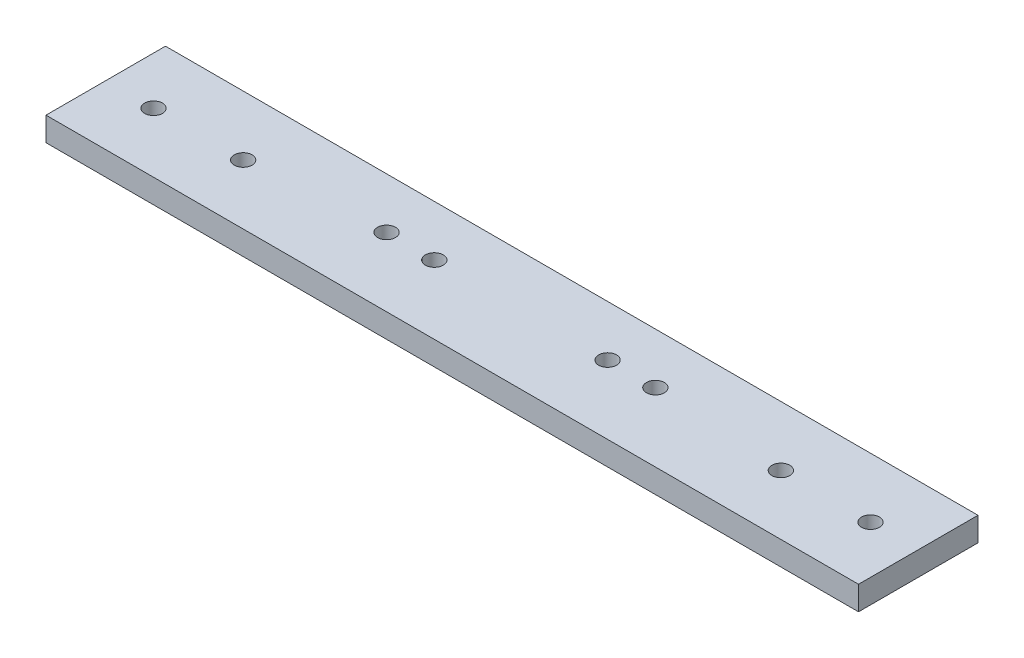
ISO-10303-21;
HEADER;
FILE_DESCRIPTION(('STEP AP214'),'2;1');
FILE_NAME('part.step','',(''),(''),'','','');
FILE_SCHEMA(('AUTOMOTIVE_DESIGN { 1 0 10303 214 1 1 1 1 }'));
ENDSEC;
DATA;
#1=APPLICATION_CONTEXT('core data for automotive mechanical design processes');
#2=APPLICATION_PROTOCOL_DEFINITION('international standard','automotive_design',2000,#1);
#3=PRODUCT_CONTEXT('',#1,'mechanical');
#4=PRODUCT('Part','Part','',(#3));
#5=PRODUCT_RELATED_PRODUCT_CATEGORY('part','',(#4));
#6=PRODUCT_DEFINITION_FORMATION('','',#4);
#7=PRODUCT_DEFINITION_CONTEXT('part definition',#1,'design');
#8=PRODUCT_DEFINITION('design','',#6,#7);
#9=PRODUCT_DEFINITION_SHAPE('','',#8);
#10=(LENGTH_UNIT() NAMED_UNIT(*) SI_UNIT(.MILLI.,.METRE.));
#11=(NAMED_UNIT(*) PLANE_ANGLE_UNIT() SI_UNIT($,.RADIAN.));
#12=(NAMED_UNIT(*) SI_UNIT($,.STERADIAN.) SOLID_ANGLE_UNIT());
#13=UNCERTAINTY_MEASURE_WITH_UNIT(LENGTH_MEASURE(1.E-05),#10,'distance_accuracy_value','');
#14=(GEOMETRIC_REPRESENTATION_CONTEXT(3) GLOBAL_UNCERTAINTY_ASSIGNED_CONTEXT((#13)) GLOBAL_UNIT_ASSIGNED_CONTEXT((#10,
#11,#12)) REPRESENTATION_CONTEXT('',''));
#15=CARTESIAN_POINT('',(0.,0.,0.));
#16=DIRECTION('',(0.,0.,1.));
#17=DIRECTION('',(1.,0.,0.));
#18=AXIS2_PLACEMENT_3D('',#15,#16,#17);
#19=CARTESIAN_POINT('',(0.,4.,0.));
#20=DIRECTION('',(0.,1.,0.));
#21=DIRECTION('',(0.,0.,1.));
#22=AXIS2_PLACEMENT_3D('',#19,#20,#21);
#23=PLANE('',#22);
#24=CARTESIAN_POINT('',(-45.0000000000002,4.,1.04744440165294E-13));
#25=DIRECTION('',(0.,1.,0.));
#26=DIRECTION('',(0.,0.,-1.));
#27=AXIS2_PLACEMENT_3D('',#24,#25,#26);
#28=CIRCLE('',#27,1.5);
#29=CARTESIAN_POINT('',(-45.0000000000002,4.,-1.49999999999989));
#30=VERTEX_POINT('',#29);
#31=EDGE_CURVE('E179',#30,#30,#28,.T.);
#32=ORIENTED_EDGE('',*,*,#31,.F.);
#33=EDGE_LOOP('',(#32));
#34=FACE_BOUND('',#33,.T.);
#35=CARTESIAN_POINT('',(60.,4.,0.));
#36=DIRECTION('',(0.,1.,0.));
#37=DIRECTION('',(0.,0.,1.));
#38=AXIS2_PLACEMENT_3D('',#35,#36,#37);
#39=CIRCLE('',#38,1.5);
#40=CARTESIAN_POINT('',(60.,4.,1.5));
#41=VERTEX_POINT('',#40);
#42=EDGE_CURVE('E163',#41,#41,#39,.T.);
#43=ORIENTED_EDGE('',*,*,#42,.F.);
#44=EDGE_LOOP('',(#43));
#45=FACE_BOUND('',#44,.T.);
#46=CARTESIAN_POINT('',(-14.5,4.,-1.49999999999994));
#47=DIRECTION('',(0.,1.,0.));
#48=DIRECTION('',(0.,0.,-1.));
#49=AXIS2_PLACEMENT_3D('',#46,#47,#48);
#50=CIRCLE('',#49,1.5);
#51=CARTESIAN_POINT('',(-14.5,4.,-2.99999999999994));
#52=VERTEX_POINT('',#51);
#53=EDGE_CURVE('E147',#52,#52,#50,.T.);
#54=ORIENTED_EDGE('',*,*,#53,.F.);
#55=EDGE_LOOP('',(#54));
#56=FACE_BOUND('',#55,.T.);
#57=CARTESIAN_POINT('',(22.5,4.,-1.5));
#58=DIRECTION('',(0.,1.,0.));
#59=DIRECTION('',(0.,0.,1.));
#60=AXIS2_PLACEMENT_3D('',#57,#58,#59);
#61=CIRCLE('',#60,1.5);
#62=CARTESIAN_POINT('',(22.5,4.,0.));
#63=VERTEX_POINT('',#62);
#64=EDGE_CURVE('E117',#63,#63,#61,.T.);
#65=ORIENTED_EDGE('',*,*,#64,.F.);
#66=EDGE_LOOP('',(#65));
#67=FACE_BOUND('',#66,.T.);
#68=DIRECTION('',(0.,0.,-1.));
#69=VECTOR('',#68,1.);
#70=CARTESIAN_POINT('',(67.9999999999999,4.,-9.99999999999999));
#71=LINE('',#70,#69);
#72=CARTESIAN_POINT('',(67.9999999999999,4.,10.));
#73=VERTEX_POINT('',#72);
#74=CARTESIAN_POINT('',(67.9999999999999,4.,-9.99999999999999));
#75=VERTEX_POINT('',#74);
#76=EDGE_CURVE('E97',#73,#75,#71,.T.);
#77=ORIENTED_EDGE('',*,*,#76,.T.);
#78=DIRECTION('',(-1.,0.,0.));
#79=VECTOR('',#78,1.);
#80=CARTESIAN_POINT('',(-68.0000000000001,4.,-9.99999999999999));
#81=LINE('',#80,#79);
#82=CARTESIAN_POINT('',(-68.0000000000001,4.,-9.99999999999999));
#83=VERTEX_POINT('',#82);
#84=EDGE_CURVE('E92',#75,#83,#81,.T.);
#85=ORIENTED_EDGE('',*,*,#84,.T.);
#86=DIRECTION('',(0.,0.,1.));
#87=VECTOR('',#86,1.);
#88=CARTESIAN_POINT('',(-68.0000000000001,4.,-9.99999999999999));
#89=LINE('',#88,#87);
#90=CARTESIAN_POINT('',(-68.0000000000001,4.,10.));
#91=VERTEX_POINT('',#90);
#92=EDGE_CURVE('E95',#83,#91,#89,.T.);
#93=ORIENTED_EDGE('',*,*,#92,.T.);
#94=DIRECTION('',(1.,0.,0.));
#95=VECTOR('',#94,1.);
#96=CARTESIAN_POINT('',(-68.0000000000001,4.,10.));
#97=LINE('',#96,#95);
#98=EDGE_CURVE('E62',#91,#73,#97,.T.);
#99=ORIENTED_EDGE('',*,*,#98,.T.);
#100=EDGE_LOOP('',(#77,#85,#93,#99));
#101=FACE_BOUND('',#100,.T.);
#102=CARTESIAN_POINT('',(14.5,4.,-1.49999999999994));
#103=DIRECTION('',(0.,1.,0.));
#104=DIRECTION('',(0.,0.,1.));
#105=AXIS2_PLACEMENT_3D('',#102,#103,#104);
#106=CIRCLE('',#105,1.5);
#107=CARTESIAN_POINT('',(14.5,4.,0.));
#108=VERTEX_POINT('',#107);
#109=EDGE_CURVE('E139',#108,#108,#106,.T.);
#110=ORIENTED_EDGE('',*,*,#109,.F.);
#111=EDGE_LOOP('',(#110));
#112=FACE_BOUND('',#111,.T.);
#113=CARTESIAN_POINT('',(-22.5,4.,-1.49999999999999));
#114=DIRECTION('',(0.,1.,0.));
#115=DIRECTION('',(0.,0.,-1.));
#116=AXIS2_PLACEMENT_3D('',#113,#114,#115);
#117=CIRCLE('',#116,1.5);
#118=CARTESIAN_POINT('',(-22.5,4.,-2.99999999999999));
#119=VERTEX_POINT('',#118);
#120=EDGE_CURVE('E155',#119,#119,#117,.T.);
#121=ORIENTED_EDGE('',*,*,#120,.F.);
#122=EDGE_LOOP('',(#121));
#123=FACE_BOUND('',#122,.T.);
#124=CARTESIAN_POINT('',(45.,4.,1.04744440165294E-13));
#125=DIRECTION('',(0.,1.,0.));
#126=DIRECTION('',(0.,0.,1.));
#127=AXIS2_PLACEMENT_3D('',#124,#125,#126);
#128=CIRCLE('',#127,1.5);
#129=CARTESIAN_POINT('',(45.,4.,1.5000000000001));
#130=VERTEX_POINT('',#129);
#131=EDGE_CURVE('E171',#130,#130,#128,.T.);
#132=ORIENTED_EDGE('',*,*,#131,.F.);
#133=EDGE_LOOP('',(#132));
#134=FACE_BOUND('',#133,.T.);
#135=CARTESIAN_POINT('',(-60.0000000000002,4.,0.));
#136=DIRECTION('',(0.,1.,0.));
#137=DIRECTION('',(0.,0.,-1.));
#138=AXIS2_PLACEMENT_3D('',#135,#136,#137);
#139=CIRCLE('',#138,1.5);
#140=CARTESIAN_POINT('',(-60.0000000000002,4.,-1.5));
#141=VERTEX_POINT('',#140);
#142=EDGE_CURVE('E187',#141,#141,#139,.T.);
#143=ORIENTED_EDGE('',*,*,#142,.F.);
#144=EDGE_LOOP('',(#143));
#145=FACE_BOUND('',#144,.T.);
#146=ADVANCED_FACE('F44',(#34,#45,#56,#67,#101,#112,#123,#134,#145),#23,.T.);
#147=CARTESIAN_POINT('',(0.,0.,0.));
#148=DIRECTION('',(0.,1.,0.));
#149=DIRECTION('',(0.,0.,1.));
#150=AXIS2_PLACEMENT_3D('',#147,#148,#149);
#151=PLANE('',#150);
#152=DIRECTION('',(0.,0.,-1.));
#153=VECTOR('',#152,1.);
#154=CARTESIAN_POINT('',(67.9999999999999,0.,-9.99999999999999));
#155=LINE('',#154,#153);
#156=CARTESIAN_POINT('',(67.9999999999999,0.,10.));
#157=VERTEX_POINT('',#156);
#158=CARTESIAN_POINT('',(67.9999999999999,0.,-9.99999999999999));
#159=VERTEX_POINT('',#158);
#160=EDGE_CURVE('E113',#157,#159,#155,.T.);
#161=ORIENTED_EDGE('',*,*,#160,.F.);
#162=DIRECTION('',(1.,0.,0.));
#163=VECTOR('',#162,1.);
#164=CARTESIAN_POINT('',(-68.0000000000001,0.,10.));
#165=LINE('',#164,#163);
#166=CARTESIAN_POINT('',(-68.0000000000001,0.,10.));
#167=VERTEX_POINT('',#166);
#168=EDGE_CURVE('E85',#167,#157,#165,.T.);
#169=ORIENTED_EDGE('',*,*,#168,.F.);
#170=DIRECTION('',(0.,0.,1.));
#171=VECTOR('',#170,1.);
#172=CARTESIAN_POINT('',(-68.0000000000001,0.,-9.99999999999999));
#173=LINE('',#172,#171);
#174=CARTESIAN_POINT('',(-68.0000000000001,0.,-9.99999999999999));
#175=VERTEX_POINT('',#174);
#176=EDGE_CURVE('E79',#175,#167,#173,.T.);
#177=ORIENTED_EDGE('',*,*,#176,.F.);
#178=DIRECTION('',(-1.,0.,0.));
#179=VECTOR('',#178,1.);
#180=CARTESIAN_POINT('',(-68.0000000000001,0.,-9.99999999999999));
#181=LINE('',#180,#179);
#182=EDGE_CURVE('E102',#159,#175,#181,.T.);
#183=ORIENTED_EDGE('',*,*,#182,.F.);
#184=EDGE_LOOP('',(#161,#169,#177,#183));
#185=FACE_BOUND('',#184,.T.);
#186=CARTESIAN_POINT('',(22.5,0.,-1.5));
#187=DIRECTION('',(0.,1.,0.));
#188=DIRECTION('',(0.,0.,1.));
#189=AXIS2_PLACEMENT_3D('',#186,#187,#188);
#190=CIRCLE('',#189,1.5);
#191=CARTESIAN_POINT('',(22.5,0.,0.));
#192=VERTEX_POINT('',#191);
#193=EDGE_CURVE('E135',#192,#192,#190,.T.);
#194=ORIENTED_EDGE('',*,*,#193,.T.);
#195=EDGE_LOOP('',(#194));
#196=FACE_BOUND('',#195,.T.);
#197=CARTESIAN_POINT('',(14.5,0.,-1.49999999999994));
#198=DIRECTION('',(0.,1.,0.));
#199=DIRECTION('',(0.,0.,1.));
#200=AXIS2_PLACEMENT_3D('',#197,#198,#199);
#201=CIRCLE('',#200,1.5);
#202=CARTESIAN_POINT('',(14.5,0.,0.));
#203=VERTEX_POINT('',#202);
#204=EDGE_CURVE('E143',#203,#203,#201,.T.);
#205=ORIENTED_EDGE('',*,*,#204,.T.);
#206=EDGE_LOOP('',(#205));
#207=FACE_BOUND('',#206,.T.);
#208=CARTESIAN_POINT('',(-14.5,0.,-1.49999999999994));
#209=DIRECTION('',(0.,1.,0.));
#210=DIRECTION('',(0.,0.,-1.));
#211=AXIS2_PLACEMENT_3D('',#208,#209,#210);
#212=CIRCLE('',#211,1.5);
#213=CARTESIAN_POINT('',(-14.5,0.,-2.99999999999994));
#214=VERTEX_POINT('',#213);
#215=EDGE_CURVE('E151',#214,#214,#212,.T.);
#216=ORIENTED_EDGE('',*,*,#215,.T.);
#217=EDGE_LOOP('',(#216));
#218=FACE_BOUND('',#217,.T.);
#219=CARTESIAN_POINT('',(-22.5,0.,-1.49999999999999));
#220=DIRECTION('',(0.,1.,0.));
#221=DIRECTION('',(0.,0.,-1.));
#222=AXIS2_PLACEMENT_3D('',#219,#220,#221);
#223=CIRCLE('',#222,1.5);
#224=CARTESIAN_POINT('',(-22.5,0.,-2.99999999999999));
#225=VERTEX_POINT('',#224);
#226=EDGE_CURVE('E159',#225,#225,#223,.T.);
#227=ORIENTED_EDGE('',*,*,#226,.T.);
#228=EDGE_LOOP('',(#227));
#229=FACE_BOUND('',#228,.T.);
#230=CARTESIAN_POINT('',(60.,0.,0.));
#231=DIRECTION('',(0.,1.,0.));
#232=DIRECTION('',(0.,0.,1.));
#233=AXIS2_PLACEMENT_3D('',#230,#231,#232);
#234=CIRCLE('',#233,1.5);
#235=CARTESIAN_POINT('',(60.,0.,1.5));
#236=VERTEX_POINT('',#235);
#237=EDGE_CURVE('E167',#236,#236,#234,.T.);
#238=ORIENTED_EDGE('',*,*,#237,.T.);
#239=EDGE_LOOP('',(#238));
#240=FACE_BOUND('',#239,.T.);
#241=CARTESIAN_POINT('',(45.,0.,1.04744440165294E-13));
#242=DIRECTION('',(0.,1.,0.));
#243=DIRECTION('',(0.,0.,1.));
#244=AXIS2_PLACEMENT_3D('',#241,#242,#243);
#245=CIRCLE('',#244,1.5);
#246=CARTESIAN_POINT('',(45.,0.,1.5000000000001));
#247=VERTEX_POINT('',#246);
#248=EDGE_CURVE('E175',#247,#247,#245,.T.);
#249=ORIENTED_EDGE('',*,*,#248,.T.);
#250=EDGE_LOOP('',(#249));
#251=FACE_BOUND('',#250,.T.);
#252=CARTESIAN_POINT('',(-45.0000000000002,0.,1.04744440165294E-13));
#253=DIRECTION('',(0.,1.,0.));
#254=DIRECTION('',(0.,0.,-1.));
#255=AXIS2_PLACEMENT_3D('',#252,#253,#254);
#256=CIRCLE('',#255,1.5);
#257=CARTESIAN_POINT('',(-45.0000000000002,0.,-1.49999999999989));
#258=VERTEX_POINT('',#257);
#259=EDGE_CURVE('E183',#258,#258,#256,.T.);
#260=ORIENTED_EDGE('',*,*,#259,.T.);
#261=EDGE_LOOP('',(#260));
#262=FACE_BOUND('',#261,.T.);
#263=CARTESIAN_POINT('',(-60.0000000000002,0.,0.));
#264=DIRECTION('',(0.,1.,0.));
#265=DIRECTION('',(0.,0.,-1.));
#266=AXIS2_PLACEMENT_3D('',#263,#264,#265);
#267=CIRCLE('',#266,1.5);
#268=CARTESIAN_POINT('',(-60.0000000000002,0.,-1.5));
#269=VERTEX_POINT('',#268);
#270=EDGE_CURVE('E191',#269,#269,#267,.T.);
#271=ORIENTED_EDGE('',*,*,#270,.T.);
#272=EDGE_LOOP('',(#271));
#273=FACE_BOUND('',#272,.T.);
#274=ADVANCED_FACE('F130',(#185,#196,#207,#218,#229,#240,#251,#262,#273),#151,.F.);
#275=CARTESIAN_POINT('',(67.9999999999999,4.,-9.99999999999999));
#276=DIRECTION('',(-1.,0.,0.));
#277=DIRECTION('',(0.,0.,1.));
#278=AXIS2_PLACEMENT_3D('',#275,#276,#277);
#279=PLANE('',#278);
#280=ORIENTED_EDGE('',*,*,#160,.T.);
#281=DIRECTION('',(0.,-1.,0.));
#282=VECTOR('',#281,1.);
#283=CARTESIAN_POINT('',(67.9999999999999,4.,-9.99999999999999));
#284=LINE('',#283,#282);
#285=EDGE_CURVE('E11',#75,#159,#284,.T.);
#286=ORIENTED_EDGE('',*,*,#285,.F.);
#287=ORIENTED_EDGE('',*,*,#76,.F.);
#288=DIRECTION('',(0.,-1.,0.));
#289=VECTOR('',#288,1.);
#290=CARTESIAN_POINT('',(67.9999999999999,4.,10.));
#291=LINE('',#290,#289);
#292=EDGE_CURVE('E109',#73,#157,#291,.T.);
#293=ORIENTED_EDGE('',*,*,#292,.T.);
#294=EDGE_LOOP('',(#280,#286,#287,#293));
#295=FACE_BOUND('',#294,.T.);
#296=ADVANCED_FACE('F46',(#295),#279,.F.);
#297=CARTESIAN_POINT('',(-68.0000000000001,4.,-9.99999999999999));
#298=DIRECTION('',(0.,0.,1.));
#299=DIRECTION('',(1.,0.,0.));
#300=AXIS2_PLACEMENT_3D('',#297,#298,#299);
#301=PLANE('',#300);
#302=ORIENTED_EDGE('',*,*,#182,.T.);
#303=DIRECTION('',(0.,-1.,0.));
#304=VECTOR('',#303,1.);
#305=CARTESIAN_POINT('',(-68.0000000000001,4.,-9.99999999999999));
#306=LINE('',#305,#304);
#307=EDGE_CURVE('E54',#83,#175,#306,.T.);
#308=ORIENTED_EDGE('',*,*,#307,.F.);
#309=ORIENTED_EDGE('',*,*,#84,.F.);
#310=ORIENTED_EDGE('',*,*,#285,.T.);
#311=EDGE_LOOP('',(#302,#308,#309,#310));
#312=FACE_BOUND('',#311,.T.);
#313=ADVANCED_FACE('F101',(#312),#301,.F.);
#314=CARTESIAN_POINT('',(-68.0000000000001,4.,-9.99999999999999));
#315=DIRECTION('',(1.,0.,0.));
#316=DIRECTION('',(0.,0.,-1.));
#317=AXIS2_PLACEMENT_3D('',#314,#315,#316);
#318=PLANE('',#317);
#319=ORIENTED_EDGE('',*,*,#176,.T.);
#320=DIRECTION('',(0.,-1.,0.));
#321=VECTOR('',#320,1.);
#322=CARTESIAN_POINT('',(-68.0000000000001,4.,10.));
#323=LINE('',#322,#321);
#324=EDGE_CURVE('E104',#91,#167,#323,.T.);
#325=ORIENTED_EDGE('',*,*,#324,.F.);
#326=ORIENTED_EDGE('',*,*,#92,.F.);
#327=ORIENTED_EDGE('',*,*,#307,.T.);
#328=EDGE_LOOP('',(#319,#325,#326,#327));
#329=FACE_BOUND('',#328,.T.);
#330=ADVANCED_FACE('F105',(#329),#318,.F.);
#331=CARTESIAN_POINT('',(-68.0000000000001,4.,10.));
#332=DIRECTION('',(0.,0.,-1.));
#333=DIRECTION('',(-1.,0.,0.));
#334=AXIS2_PLACEMENT_3D('',#331,#332,#333);
#335=PLANE('',#334);
#336=ORIENTED_EDGE('',*,*,#168,.T.);
#337=ORIENTED_EDGE('',*,*,#292,.F.);
#338=ORIENTED_EDGE('',*,*,#98,.F.);
#339=ORIENTED_EDGE('',*,*,#324,.T.);
#340=EDGE_LOOP('',(#336,#337,#338,#339));
#341=FACE_BOUND('',#340,.T.);
#342=ADVANCED_FACE('F127',(#341),#335,.F.);
#343=CARTESIAN_POINT('',(22.5,4.,-1.5));
#344=DIRECTION('',(0.,-1.,0.));
#345=DIRECTION('',(0.,0.,-1.));
#346=AXIS2_PLACEMENT_3D('',#343,#344,#345);
#347=CYLINDRICAL_SURFACE('',#346,1.5);
#348=ORIENTED_EDGE('',*,*,#64,.T.);
#349=EDGE_LOOP('',(#348));
#350=FACE_BOUND('',#349,.T.);
#351=ORIENTED_EDGE('',*,*,#193,.F.);
#352=EDGE_LOOP('',(#351));
#353=FACE_BOUND('',#352,.T.);
#354=ADVANCED_FACE('F212',(#350,#353),#347,.F.);
#355=CARTESIAN_POINT('',(14.5,4.,-1.49999999999994));
#356=DIRECTION('',(0.,-1.,0.));
#357=DIRECTION('',(0.,0.,-1.));
#358=AXIS2_PLACEMENT_3D('',#355,#356,#357);
#359=CYLINDRICAL_SURFACE('',#358,1.5);
#360=ORIENTED_EDGE('',*,*,#109,.T.);
#361=EDGE_LOOP('',(#360));
#362=FACE_BOUND('',#361,.T.);
#363=ORIENTED_EDGE('',*,*,#204,.F.);
#364=EDGE_LOOP('',(#363));
#365=FACE_BOUND('',#364,.T.);
#366=ADVANCED_FACE('F257',(#362,#365),#359,.F.);
#367=CARTESIAN_POINT('',(-14.5,4.,-1.49999999999994));
#368=DIRECTION('',(0.,-1.,0.));
#369=DIRECTION('',(0.,0.,-1.));
#370=AXIS2_PLACEMENT_3D('',#367,#368,#369);
#371=CYLINDRICAL_SURFACE('',#370,1.5);
#372=ORIENTED_EDGE('',*,*,#53,.T.);
#373=EDGE_LOOP('',(#372));
#374=FACE_BOUND('',#373,.T.);
#375=ORIENTED_EDGE('',*,*,#215,.F.);
#376=EDGE_LOOP('',(#375));
#377=FACE_BOUND('',#376,.T.);
#378=ADVANCED_FACE('F265',(#374,#377),#371,.F.);
#379=CARTESIAN_POINT('',(-22.5,4.,-1.49999999999999));
#380=DIRECTION('',(0.,-1.,0.));
#381=DIRECTION('',(0.,0.,-1.));
#382=AXIS2_PLACEMENT_3D('',#379,#380,#381);
#383=CYLINDRICAL_SURFACE('',#382,1.5);
#384=ORIENTED_EDGE('',*,*,#120,.T.);
#385=EDGE_LOOP('',(#384));
#386=FACE_BOUND('',#385,.T.);
#387=ORIENTED_EDGE('',*,*,#226,.F.);
#388=EDGE_LOOP('',(#387));
#389=FACE_BOUND('',#388,.T.);
#390=ADVANCED_FACE('F273',(#386,#389),#383,.F.);
#391=CARTESIAN_POINT('',(60.,4.,0.));
#392=DIRECTION('',(0.,-1.,0.));
#393=DIRECTION('',(0.,0.,-1.));
#394=AXIS2_PLACEMENT_3D('',#391,#392,#393);
#395=CYLINDRICAL_SURFACE('',#394,1.5);
#396=ORIENTED_EDGE('',*,*,#42,.T.);
#397=EDGE_LOOP('',(#396));
#398=FACE_BOUND('',#397,.T.);
#399=ORIENTED_EDGE('',*,*,#237,.F.);
#400=EDGE_LOOP('',(#399));
#401=FACE_BOUND('',#400,.T.);
#402=ADVANCED_FACE('F282',(#398,#401),#395,.F.);
#403=CARTESIAN_POINT('',(45.,4.,1.04744440165294E-13));
#404=DIRECTION('',(0.,-1.,0.));
#405=DIRECTION('',(0.,0.,-1.));
#406=AXIS2_PLACEMENT_3D('',#403,#404,#405);
#407=CYLINDRICAL_SURFACE('',#406,1.5);
#408=ORIENTED_EDGE('',*,*,#131,.T.);
#409=EDGE_LOOP('',(#408));
#410=FACE_BOUND('',#409,.T.);
#411=ORIENTED_EDGE('',*,*,#248,.F.);
#412=EDGE_LOOP('',(#411));
#413=FACE_BOUND('',#412,.T.);
#414=ADVANCED_FACE('F291',(#410,#413),#407,.F.);
#415=CARTESIAN_POINT('',(-45.0000000000002,4.,1.04744440165294E-13));
#416=DIRECTION('',(0.,-1.,0.));
#417=DIRECTION('',(0.,0.,-1.));
#418=AXIS2_PLACEMENT_3D('',#415,#416,#417);
#419=CYLINDRICAL_SURFACE('',#418,1.5);
#420=ORIENTED_EDGE('',*,*,#31,.T.);
#421=EDGE_LOOP('',(#420));
#422=FACE_BOUND('',#421,.T.);
#423=ORIENTED_EDGE('',*,*,#259,.F.);
#424=EDGE_LOOP('',(#423));
#425=FACE_BOUND('',#424,.T.);
#426=ADVANCED_FACE('F300',(#422,#425),#419,.F.);
#427=CARTESIAN_POINT('',(-60.0000000000002,4.,0.));
#428=DIRECTION('',(0.,-1.,0.));
#429=DIRECTION('',(0.,0.,-1.));
#430=AXIS2_PLACEMENT_3D('',#427,#428,#429);
#431=CYLINDRICAL_SURFACE('',#430,1.5);
#432=ORIENTED_EDGE('',*,*,#142,.T.);
#433=EDGE_LOOP('',(#432));
#434=FACE_BOUND('',#433,.T.);
#435=ORIENTED_EDGE('',*,*,#270,.F.);
#436=EDGE_LOOP('',(#435));
#437=FACE_BOUND('',#436,.T.);
#438=ADVANCED_FACE('F199',(#434,#437),#431,.F.);
#439=CLOSED_SHELL('',(#146,#274,#296,#313,#330,#342,#354,#366,#378,#390,#402,#414,#426,#438));
#440=MANIFOLD_SOLID_BREP('B2',#439);
#441=ADVANCED_BREP_SHAPE_REPRESENTATION('',(#18,#440),#14);
#442=SHAPE_DEFINITION_REPRESENTATION(#9,#441);
ENDSEC;
END-ISO-10303-21;
